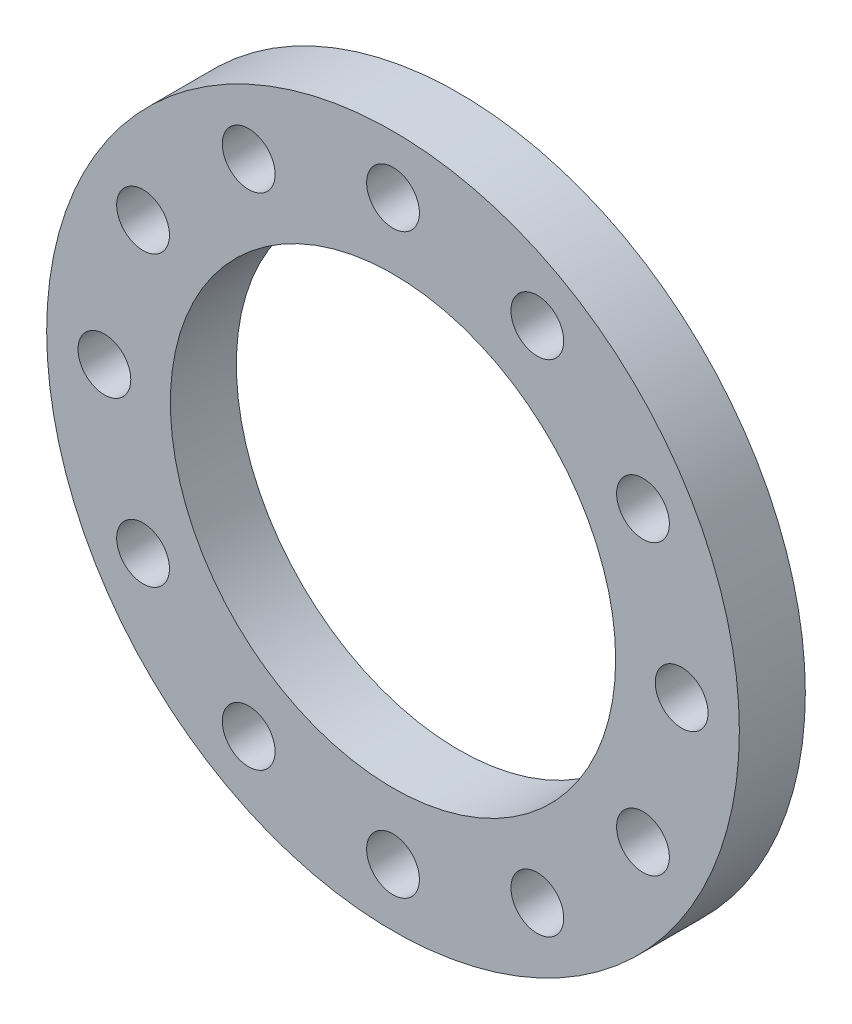
ISO-10303-21;
HEADER;
FILE_DESCRIPTION(('STEP AP214'),'2;1');
FILE_NAME('part.step','',(''),(''),'','','');
FILE_SCHEMA(('AUTOMOTIVE_DESIGN { 1 0 10303 214 1 1 1 1 }'));
ENDSEC;
DATA;
#1=APPLICATION_CONTEXT('core data for automotive mechanical design processes');
#2=APPLICATION_PROTOCOL_DEFINITION('international standard','automotive_design',2000,#1);
#3=PRODUCT_CONTEXT('',#1,'mechanical');
#4=PRODUCT('Part','Part','',(#3));
#5=PRODUCT_RELATED_PRODUCT_CATEGORY('part','',(#4));
#6=PRODUCT_DEFINITION_FORMATION('','',#4);
#7=PRODUCT_DEFINITION_CONTEXT('part definition',#1,'design');
#8=PRODUCT_DEFINITION('design','',#6,#7);
#9=PRODUCT_DEFINITION_SHAPE('','',#8);
#10=(LENGTH_UNIT() NAMED_UNIT(*) SI_UNIT(.MILLI.,.METRE.));
#11=(NAMED_UNIT(*) PLANE_ANGLE_UNIT() SI_UNIT($,.RADIAN.));
#12=(NAMED_UNIT(*) SI_UNIT($,.STERADIAN.) SOLID_ANGLE_UNIT());
#13=UNCERTAINTY_MEASURE_WITH_UNIT(LENGTH_MEASURE(1.E-05),#10,'distance_accuracy_value','');
#14=(GEOMETRIC_REPRESENTATION_CONTEXT(3) GLOBAL_UNCERTAINTY_ASSIGNED_CONTEXT((#13)) GLOBAL_UNIT_ASSIGNED_CONTEXT((#10,
#11,#12)) REPRESENTATION_CONTEXT('',''));
#15=CARTESIAN_POINT('',(0.,0.,0.));
#16=DIRECTION('',(0.,0.,1.));
#17=DIRECTION('',(1.,0.,0.));
#18=AXIS2_PLACEMENT_3D('',#15,#16,#17);
#19=CARTESIAN_POINT('',(0.,0.,4.));
#20=DIRECTION('',(0.,0.,1.));
#21=DIRECTION('',(1.,0.,0.));
#22=AXIS2_PLACEMENT_3D('',#19,#20,#21);
#23=PLANE('',#22);
#24=CARTESIAN_POINT('',(15.1554445662292,8.74999999999743,4.));
#25=DIRECTION('',(0.,0.,1.));
#26=DIRECTION('',(1.,0.,0.));
#27=AXIS2_PLACEMENT_3D('',#24,#25,#26);
#28=CIRCLE('',#27,1.6);
#29=CARTESIAN_POINT('',(16.7554445662292,8.74999999999743,4.));
#30=VERTEX_POINT('',#29);
#31=EDGE_CURVE('E111',#30,#30,#28,.T.);
#32=ORIENTED_EDGE('',*,*,#31,.F.);
#33=EDGE_LOOP('',(#32));
#34=FACE_BOUND('',#33,.T.);
#35=CARTESIAN_POINT('',(-15.1554445662262,-8.75000000000258,4.));
#36=DIRECTION('',(0.,0.,1.));
#37=DIRECTION('',(1.,0.,0.));
#38=AXIS2_PLACEMENT_3D('',#35,#36,#37);
#39=CIRCLE('',#38,1.6);
#40=CARTESIAN_POINT('',(-13.5554445662262,-8.75000000000258,4.));
#41=VERTEX_POINT('',#40);
#42=EDGE_CURVE('E99',#41,#41,#39,.T.);
#43=ORIENTED_EDGE('',*,*,#42,.F.);
#44=EDGE_LOOP('',(#43));
#45=FACE_BOUND('',#44,.T.);
#46=CARTESIAN_POINT('',(-15.1554445662247,8.75,4.));
#47=DIRECTION('',(0.,0.,1.));
#48=DIRECTION('',(1.,0.,0.));
#49=AXIS2_PLACEMENT_3D('',#46,#47,#48);
#50=CIRCLE('',#49,1.6);
#51=CARTESIAN_POINT('',(-13.5554445662247,8.75,4.));
#52=VERTEX_POINT('',#51);
#53=EDGE_CURVE('E87',#52,#52,#50,.T.);
#54=ORIENTED_EDGE('',*,*,#53,.F.);
#55=EDGE_LOOP('',(#54));
#56=FACE_BOUND('',#55,.T.);
#57=CARTESIAN_POINT('',(15.1554445662306,-8.75,4.));
#58=DIRECTION('',(0.,0.,1.));
#59=DIRECTION('',(1.,0.,0.));
#60=AXIS2_PLACEMENT_3D('',#57,#58,#59);
#61=CIRCLE('',#60,1.6);
#62=CARTESIAN_POINT('',(16.7554445662306,-8.75,4.));
#63=VERTEX_POINT('',#62);
#64=EDGE_CURVE('E75',#63,#63,#61,.T.);
#65=ORIENTED_EDGE('',*,*,#64,.F.);
#66=EDGE_LOOP('',(#65));
#67=FACE_BOUND('',#66,.T.);
#68=CARTESIAN_POINT('',(0.,-17.5,4.));
#69=DIRECTION('',(0.,0.,1.));
#70=DIRECTION('',(1.,0.,0.));
#71=AXIS2_PLACEMENT_3D('',#68,#69,#70);
#72=CIRCLE('',#71,1.6);
#73=CARTESIAN_POINT('',(1.6,-17.5,4.));
#74=VERTEX_POINT('',#73);
#75=EDGE_CURVE('E63',#74,#74,#72,.T.);
#76=ORIENTED_EDGE('',*,*,#75,.F.);
#77=EDGE_LOOP('',(#76));
#78=FACE_BOUND('',#77,.T.);
#79=CARTESIAN_POINT('',(0.,17.5,4.));
#80=DIRECTION('',(0.,0.,1.));
#81=DIRECTION('',(1.,0.,0.));
#82=AXIS2_PLACEMENT_3D('',#79,#80,#81);
#83=CIRCLE('',#82,1.6);
#84=CARTESIAN_POINT('',(1.6,17.5,4.));
#85=VERTEX_POINT('',#84);
#86=EDGE_CURVE('E51',#85,#85,#83,.T.);
#87=ORIENTED_EDGE('',*,*,#86,.F.);
#88=EDGE_LOOP('',(#87));
#89=FACE_BOUND('',#88,.T.);
#90=CARTESIAN_POINT('',(0.,0.,4.));
#91=DIRECTION('',(0.,0.,1.));
#92=DIRECTION('',(1.,0.,0.));
#93=AXIS2_PLACEMENT_3D('',#90,#91,#92);
#94=CIRCLE('',#93,21.);
#95=CARTESIAN_POINT('',(21.,0.,4.));
#96=VERTEX_POINT('',#95);
#97=EDGE_CURVE('E10',#96,#96,#94,.T.);
#98=ORIENTED_EDGE('',*,*,#97,.T.);
#99=EDGE_LOOP('',(#98));
#100=FACE_BOUND('',#99,.T.);
#101=CARTESIAN_POINT('',(0.,0.,4.));
#102=DIRECTION('',(0.,0.,1.));
#103=DIRECTION('',(1.,0.,0.));
#104=AXIS2_PLACEMENT_3D('',#101,#102,#103);
#105=CIRCLE('',#104,13.5);
#106=CARTESIAN_POINT('',(13.5,0.,4.));
#107=VERTEX_POINT('',#106);
#108=EDGE_CURVE('E46',#107,#107,#105,.T.);
#109=ORIENTED_EDGE('',*,*,#108,.F.);
#110=EDGE_LOOP('',(#109));
#111=FACE_BOUND('',#110,.T.);
#112=CARTESIAN_POINT('',(17.5,0.,4.));
#113=DIRECTION('',(0.,0.,1.));
#114=DIRECTION('',(1.,0.,0.));
#115=AXIS2_PLACEMENT_3D('',#112,#113,#114);
#116=CIRCLE('',#115,1.6);
#117=CARTESIAN_POINT('',(19.1,0.,4.));
#118=VERTEX_POINT('',#117);
#119=EDGE_CURVE('E57',#118,#118,#116,.T.);
#120=ORIENTED_EDGE('',*,*,#119,.F.);
#121=EDGE_LOOP('',(#120));
#122=FACE_BOUND('',#121,.T.);
#123=CARTESIAN_POINT('',(-17.5,0.,4.));
#124=DIRECTION('',(0.,0.,1.));
#125=DIRECTION('',(1.,0.,0.));
#126=AXIS2_PLACEMENT_3D('',#123,#124,#125);
#127=CIRCLE('',#126,1.6);
#128=CARTESIAN_POINT('',(-15.9,0.,4.));
#129=VERTEX_POINT('',#128);
#130=EDGE_CURVE('E69',#129,#129,#127,.T.);
#131=ORIENTED_EDGE('',*,*,#130,.F.);
#132=EDGE_LOOP('',(#131));
#133=FACE_BOUND('',#132,.T.);
#134=CARTESIAN_POINT('',(-8.74999999999703,-15.1554445662277,4.));
#135=DIRECTION('',(0.,0.,1.));
#136=DIRECTION('',(1.,0.,0.));
#137=AXIS2_PLACEMENT_3D('',#134,#135,#136);
#138=CIRCLE('',#137,1.6);
#139=CARTESIAN_POINT('',(-7.14999999999703,-15.1554445662277,4.));
#140=VERTEX_POINT('',#139);
#141=EDGE_CURVE('E81',#140,#140,#138,.T.);
#142=ORIENTED_EDGE('',*,*,#141,.F.);
#143=EDGE_LOOP('',(#142));
#144=FACE_BOUND('',#143,.T.);
#145=CARTESIAN_POINT('',(8.75000000000297,15.1554445662277,4.));
#146=DIRECTION('',(0.,0.,1.));
#147=DIRECTION('',(1.,0.,0.));
#148=AXIS2_PLACEMENT_3D('',#145,#146,#147);
#149=CIRCLE('',#148,1.6);
#150=CARTESIAN_POINT('',(10.350000000003,15.1554445662277,4.));
#151=VERTEX_POINT('',#150);
#152=EDGE_CURVE('E93',#151,#151,#149,.T.);
#153=ORIENTED_EDGE('',*,*,#152,.F.);
#154=EDGE_LOOP('',(#153));
#155=FACE_BOUND('',#154,.T.);
#156=CARTESIAN_POINT('',(-8.74999999999852,15.1554445662251,4.));
#157=DIRECTION('',(0.,0.,1.));
#158=DIRECTION('',(1.,0.,0.));
#159=AXIS2_PLACEMENT_3D('',#156,#157,#158);
#160=CIRCLE('',#159,1.6);
#161=CARTESIAN_POINT('',(-7.14999999999853,15.1554445662251,4.));
#162=VERTEX_POINT('',#161);
#163=EDGE_CURVE('E105',#162,#162,#160,.T.);
#164=ORIENTED_EDGE('',*,*,#163,.F.);
#165=EDGE_LOOP('',(#164));
#166=FACE_BOUND('',#165,.T.);
#167=CARTESIAN_POINT('',(8.75000000000149,-15.1554445662302,4.));
#168=DIRECTION('',(0.,0.,1.));
#169=DIRECTION('',(1.,0.,0.));
#170=AXIS2_PLACEMENT_3D('',#167,#168,#169);
#171=CIRCLE('',#170,1.6);
#172=CARTESIAN_POINT('',(10.3500000000015,-15.1554445662302,4.));
#173=VERTEX_POINT('',#172);
#174=EDGE_CURVE('E117',#173,#173,#171,.T.);
#175=ORIENTED_EDGE('',*,*,#174,.F.);
#176=EDGE_LOOP('',(#175));
#177=FACE_BOUND('',#176,.T.);
#178=ADVANCED_FACE('F35',(#34,#45,#56,#67,#78,#89,#100,#111,#122,#133,#144,#155,#166,#177),#23,.T.);
#179=CARTESIAN_POINT('',(0.,0.,0.));
#180=DIRECTION('',(0.,0.,1.));
#181=DIRECTION('',(1.,0.,0.));
#182=AXIS2_PLACEMENT_3D('',#179,#180,#181);
#183=PLANE('',#182);
#184=CARTESIAN_POINT('',(0.,0.,0.));
#185=DIRECTION('',(0.,0.,1.));
#186=DIRECTION('',(1.,0.,0.));
#187=AXIS2_PLACEMENT_3D('',#184,#185,#186);
#188=CIRCLE('',#187,21.);
#189=CARTESIAN_POINT('',(21.,0.,0.));
#190=VERTEX_POINT('',#189);
#191=EDGE_CURVE('E39',#190,#190,#188,.T.);
#192=ORIENTED_EDGE('',*,*,#191,.F.);
#193=EDGE_LOOP('',(#192));
#194=FACE_BOUND('',#193,.T.);
#195=CARTESIAN_POINT('',(0.,0.,0.));
#196=DIRECTION('',(0.,0.,1.));
#197=DIRECTION('',(1.,0.,0.));
#198=AXIS2_PLACEMENT_3D('',#195,#196,#197);
#199=CIRCLE('',#198,13.5);
#200=CARTESIAN_POINT('',(13.5,0.,0.));
#201=VERTEX_POINT('',#200);
#202=EDGE_CURVE('E48',#201,#201,#199,.T.);
#203=ORIENTED_EDGE('',*,*,#202,.T.);
#204=EDGE_LOOP('',(#203));
#205=FACE_BOUND('',#204,.T.);
#206=CARTESIAN_POINT('',(0.,17.5,0.));
#207=DIRECTION('',(0.,0.,1.));
#208=DIRECTION('',(1.,0.,0.));
#209=AXIS2_PLACEMENT_3D('',#206,#207,#208);
#210=CIRCLE('',#209,1.6);
#211=CARTESIAN_POINT('',(1.6,17.5,0.));
#212=VERTEX_POINT('',#211);
#213=EDGE_CURVE('E54',#212,#212,#210,.T.);
#214=ORIENTED_EDGE('',*,*,#213,.T.);
#215=EDGE_LOOP('',(#214));
#216=FACE_BOUND('',#215,.T.);
#217=CARTESIAN_POINT('',(17.5,0.,0.));
#218=DIRECTION('',(0.,0.,1.));
#219=DIRECTION('',(1.,0.,0.));
#220=AXIS2_PLACEMENT_3D('',#217,#218,#219);
#221=CIRCLE('',#220,1.6);
#222=CARTESIAN_POINT('',(19.1,0.,0.));
#223=VERTEX_POINT('',#222);
#224=EDGE_CURVE('E60',#223,#223,#221,.T.);
#225=ORIENTED_EDGE('',*,*,#224,.T.);
#226=EDGE_LOOP('',(#225));
#227=FACE_BOUND('',#226,.T.);
#228=CARTESIAN_POINT('',(0.,-17.5,0.));
#229=DIRECTION('',(0.,0.,1.));
#230=DIRECTION('',(1.,0.,0.));
#231=AXIS2_PLACEMENT_3D('',#228,#229,#230);
#232=CIRCLE('',#231,1.6);
#233=CARTESIAN_POINT('',(1.6,-17.5,0.));
#234=VERTEX_POINT('',#233);
#235=EDGE_CURVE('E66',#234,#234,#232,.T.);
#236=ORIENTED_EDGE('',*,*,#235,.T.);
#237=EDGE_LOOP('',(#236));
#238=FACE_BOUND('',#237,.T.);
#239=CARTESIAN_POINT('',(-17.5,0.,0.));
#240=DIRECTION('',(0.,0.,1.));
#241=DIRECTION('',(1.,0.,0.));
#242=AXIS2_PLACEMENT_3D('',#239,#240,#241);
#243=CIRCLE('',#242,1.6);
#244=CARTESIAN_POINT('',(-15.9,0.,0.));
#245=VERTEX_POINT('',#244);
#246=EDGE_CURVE('E72',#245,#245,#243,.T.);
#247=ORIENTED_EDGE('',*,*,#246,.T.);
#248=EDGE_LOOP('',(#247));
#249=FACE_BOUND('',#248,.T.);
#250=CARTESIAN_POINT('',(15.1554445662306,-8.75,0.));
#251=DIRECTION('',(0.,0.,1.));
#252=DIRECTION('',(1.,0.,0.));
#253=AXIS2_PLACEMENT_3D('',#250,#251,#252);
#254=CIRCLE('',#253,1.6);
#255=CARTESIAN_POINT('',(16.7554445662306,-8.75,0.));
#256=VERTEX_POINT('',#255);
#257=EDGE_CURVE('E78',#256,#256,#254,.T.);
#258=ORIENTED_EDGE('',*,*,#257,.T.);
#259=EDGE_LOOP('',(#258));
#260=FACE_BOUND('',#259,.T.);
#261=CARTESIAN_POINT('',(-8.74999999999703,-15.1554445662277,0.));
#262=DIRECTION('',(0.,0.,1.));
#263=DIRECTION('',(1.,0.,0.));
#264=AXIS2_PLACEMENT_3D('',#261,#262,#263);
#265=CIRCLE('',#264,1.6);
#266=CARTESIAN_POINT('',(-7.14999999999703,-15.1554445662277,0.));
#267=VERTEX_POINT('',#266);
#268=EDGE_CURVE('E84',#267,#267,#265,.T.);
#269=ORIENTED_EDGE('',*,*,#268,.T.);
#270=EDGE_LOOP('',(#269));
#271=FACE_BOUND('',#270,.T.);
#272=CARTESIAN_POINT('',(-15.1554445662247,8.75,0.));
#273=DIRECTION('',(0.,0.,1.));
#274=DIRECTION('',(1.,0.,0.));
#275=AXIS2_PLACEMENT_3D('',#272,#273,#274);
#276=CIRCLE('',#275,1.6);
#277=CARTESIAN_POINT('',(-13.5554445662247,8.75,0.));
#278=VERTEX_POINT('',#277);
#279=EDGE_CURVE('E90',#278,#278,#276,.T.);
#280=ORIENTED_EDGE('',*,*,#279,.T.);
#281=EDGE_LOOP('',(#280));
#282=FACE_BOUND('',#281,.T.);
#283=CARTESIAN_POINT('',(8.75000000000297,15.1554445662277,0.));
#284=DIRECTION('',(0.,0.,1.));
#285=DIRECTION('',(1.,0.,0.));
#286=AXIS2_PLACEMENT_3D('',#283,#284,#285);
#287=CIRCLE('',#286,1.6);
#288=CARTESIAN_POINT('',(10.350000000003,15.1554445662277,0.));
#289=VERTEX_POINT('',#288);
#290=EDGE_CURVE('E96',#289,#289,#287,.T.);
#291=ORIENTED_EDGE('',*,*,#290,.T.);
#292=EDGE_LOOP('',(#291));
#293=FACE_BOUND('',#292,.T.);
#294=CARTESIAN_POINT('',(-15.1554445662262,-8.75000000000258,0.));
#295=DIRECTION('',(0.,0.,1.));
#296=DIRECTION('',(1.,0.,0.));
#297=AXIS2_PLACEMENT_3D('',#294,#295,#296);
#298=CIRCLE('',#297,1.6);
#299=CARTESIAN_POINT('',(-13.5554445662262,-8.75000000000258,0.));
#300=VERTEX_POINT('',#299);
#301=EDGE_CURVE('E102',#300,#300,#298,.T.);
#302=ORIENTED_EDGE('',*,*,#301,.T.);
#303=EDGE_LOOP('',(#302));
#304=FACE_BOUND('',#303,.T.);
#305=CARTESIAN_POINT('',(-8.74999999999852,15.1554445662251,0.));
#306=DIRECTION('',(0.,0.,1.));
#307=DIRECTION('',(1.,0.,0.));
#308=AXIS2_PLACEMENT_3D('',#305,#306,#307);
#309=CIRCLE('',#308,1.6);
#310=CARTESIAN_POINT('',(-7.14999999999853,15.1554445662251,0.));
#311=VERTEX_POINT('',#310);
#312=EDGE_CURVE('E108',#311,#311,#309,.T.);
#313=ORIENTED_EDGE('',*,*,#312,.T.);
#314=EDGE_LOOP('',(#313));
#315=FACE_BOUND('',#314,.T.);
#316=CARTESIAN_POINT('',(15.1554445662292,8.74999999999743,0.));
#317=DIRECTION('',(0.,0.,1.));
#318=DIRECTION('',(1.,0.,0.));
#319=AXIS2_PLACEMENT_3D('',#316,#317,#318);
#320=CIRCLE('',#319,1.6);
#321=CARTESIAN_POINT('',(16.7554445662292,8.74999999999743,0.));
#322=VERTEX_POINT('',#321);
#323=EDGE_CURVE('E114',#322,#322,#320,.T.);
#324=ORIENTED_EDGE('',*,*,#323,.T.);
#325=EDGE_LOOP('',(#324));
#326=FACE_BOUND('',#325,.T.);
#327=CARTESIAN_POINT('',(8.75000000000149,-15.1554445662302,0.));
#328=DIRECTION('',(0.,0.,1.));
#329=DIRECTION('',(1.,0.,0.));
#330=AXIS2_PLACEMENT_3D('',#327,#328,#329);
#331=CIRCLE('',#330,1.6);
#332=CARTESIAN_POINT('',(10.3500000000015,-15.1554445662302,0.));
#333=VERTEX_POINT('',#332);
#334=EDGE_CURVE('E120',#333,#333,#331,.T.);
#335=ORIENTED_EDGE('',*,*,#334,.T.);
#336=EDGE_LOOP('',(#335));
#337=FACE_BOUND('',#336,.T.);
#338=ADVANCED_FACE('F130',(#194,#205,#216,#227,#238,#249,#260,#271,#282,#293,#304,#315,#326,
#337),#183,.F.);
#339=CARTESIAN_POINT('',(0.,0.,4.));
#340=DIRECTION('',(0.,0.,-1.));
#341=DIRECTION('',(-1.,0.,0.));
#342=AXIS2_PLACEMENT_3D('',#339,#340,#341);
#343=CYLINDRICAL_SURFACE('',#342,21.);
#344=ORIENTED_EDGE('',*,*,#97,.F.);
#345=EDGE_LOOP('',(#344));
#346=FACE_BOUND('',#345,.T.);
#347=ORIENTED_EDGE('',*,*,#191,.T.);
#348=EDGE_LOOP('',(#347));
#349=FACE_BOUND('',#348,.T.);
#350=ADVANCED_FACE('F37',(#346,#349),#343,.T.);
#351=CARTESIAN_POINT('',(0.,0.,4.));
#352=DIRECTION('',(0.,0.,-1.));
#353=DIRECTION('',(-1.,0.,0.));
#354=AXIS2_PLACEMENT_3D('',#351,#352,#353);
#355=CYLINDRICAL_SURFACE('',#354,13.5);
#356=ORIENTED_EDGE('',*,*,#108,.T.);
#357=EDGE_LOOP('',(#356));
#358=FACE_BOUND('',#357,.T.);
#359=ORIENTED_EDGE('',*,*,#202,.F.);
#360=EDGE_LOOP('',(#359));
#361=FACE_BOUND('',#360,.T.);
#362=ADVANCED_FACE('F140',(#358,#361),#355,.F.);
#363=CARTESIAN_POINT('',(0.,17.5,4.));
#364=DIRECTION('',(0.,0.,-1.));
#365=DIRECTION('',(-1.,0.,0.));
#366=AXIS2_PLACEMENT_3D('',#363,#364,#365);
#367=CYLINDRICAL_SURFACE('',#366,1.6);
#368=ORIENTED_EDGE('',*,*,#86,.T.);
#369=EDGE_LOOP('',(#368));
#370=FACE_BOUND('',#369,.T.);
#371=ORIENTED_EDGE('',*,*,#213,.F.);
#372=EDGE_LOOP('',(#371));
#373=FACE_BOUND('',#372,.T.);
#374=ADVANCED_FACE('F143',(#370,#373),#367,.F.);
#375=CARTESIAN_POINT('',(17.5,0.,4.));
#376=DIRECTION('',(0.,0.,-1.));
#377=DIRECTION('',(-1.,0.,0.));
#378=AXIS2_PLACEMENT_3D('',#375,#376,#377);
#379=CYLINDRICAL_SURFACE('',#378,1.6);
#380=ORIENTED_EDGE('',*,*,#119,.T.);
#381=EDGE_LOOP('',(#380));
#382=FACE_BOUND('',#381,.T.);
#383=ORIENTED_EDGE('',*,*,#224,.F.);
#384=EDGE_LOOP('',(#383));
#385=FACE_BOUND('',#384,.T.);
#386=ADVANCED_FACE('F147',(#382,#385),#379,.F.);
#387=CARTESIAN_POINT('',(0.,-17.5,4.));
#388=DIRECTION('',(0.,0.,-1.));
#389=DIRECTION('',(-1.,0.,0.));
#390=AXIS2_PLACEMENT_3D('',#387,#388,#389);
#391=CYLINDRICAL_SURFACE('',#390,1.6);
#392=ORIENTED_EDGE('',*,*,#75,.T.);
#393=EDGE_LOOP('',(#392));
#394=FACE_BOUND('',#393,.T.);
#395=ORIENTED_EDGE('',*,*,#235,.F.);
#396=EDGE_LOOP('',(#395));
#397=FACE_BOUND('',#396,.T.);
#398=ADVANCED_FACE('F151',(#394,#397),#391,.F.);
#399=CARTESIAN_POINT('',(-17.5,0.,4.));
#400=DIRECTION('',(0.,0.,-1.));
#401=DIRECTION('',(-1.,0.,0.));
#402=AXIS2_PLACEMENT_3D('',#399,#400,#401);
#403=CYLINDRICAL_SURFACE('',#402,1.6);
#404=ORIENTED_EDGE('',*,*,#130,.T.);
#405=EDGE_LOOP('',(#404));
#406=FACE_BOUND('',#405,.T.);
#407=ORIENTED_EDGE('',*,*,#246,.F.);
#408=EDGE_LOOP('',(#407));
#409=FACE_BOUND('',#408,.T.);
#410=ADVANCED_FACE('F155',(#406,#409),#403,.F.);
#411=CARTESIAN_POINT('',(15.1554445662306,-8.75,4.));
#412=DIRECTION('',(0.,0.,-1.));
#413=DIRECTION('',(-1.,0.,0.));
#414=AXIS2_PLACEMENT_3D('',#411,#412,#413);
#415=CYLINDRICAL_SURFACE('',#414,1.6);
#416=ORIENTED_EDGE('',*,*,#64,.T.);
#417=EDGE_LOOP('',(#416));
#418=FACE_BOUND('',#417,.T.);
#419=ORIENTED_EDGE('',*,*,#257,.F.);
#420=EDGE_LOOP('',(#419));
#421=FACE_BOUND('',#420,.T.);
#422=ADVANCED_FACE('F159',(#418,#421),#415,.F.);
#423=CARTESIAN_POINT('',(-8.74999999999703,-15.1554445662277,4.));
#424=DIRECTION('',(0.,0.,-1.));
#425=DIRECTION('',(-1.,0.,0.));
#426=AXIS2_PLACEMENT_3D('',#423,#424,#425);
#427=CYLINDRICAL_SURFACE('',#426,1.6);
#428=ORIENTED_EDGE('',*,*,#141,.T.);
#429=EDGE_LOOP('',(#428));
#430=FACE_BOUND('',#429,.T.);
#431=ORIENTED_EDGE('',*,*,#268,.F.);
#432=EDGE_LOOP('',(#431));
#433=FACE_BOUND('',#432,.T.);
#434=ADVANCED_FACE('F163',(#430,#433),#427,.F.);
#435=CARTESIAN_POINT('',(-15.1554445662247,8.75,4.));
#436=DIRECTION('',(0.,0.,-1.));
#437=DIRECTION('',(-1.,0.,0.));
#438=AXIS2_PLACEMENT_3D('',#435,#436,#437);
#439=CYLINDRICAL_SURFACE('',#438,1.6);
#440=ORIENTED_EDGE('',*,*,#53,.T.);
#441=EDGE_LOOP('',(#440));
#442=FACE_BOUND('',#441,.T.);
#443=ORIENTED_EDGE('',*,*,#279,.F.);
#444=EDGE_LOOP('',(#443));
#445=FACE_BOUND('',#444,.T.);
#446=ADVANCED_FACE('F167',(#442,#445),#439,.F.);
#447=CARTESIAN_POINT('',(8.75000000000297,15.1554445662277,4.));
#448=DIRECTION('',(0.,0.,-1.));
#449=DIRECTION('',(-1.,0.,0.));
#450=AXIS2_PLACEMENT_3D('',#447,#448,#449);
#451=CYLINDRICAL_SURFACE('',#450,1.6);
#452=ORIENTED_EDGE('',*,*,#152,.T.);
#453=EDGE_LOOP('',(#452));
#454=FACE_BOUND('',#453,.T.);
#455=ORIENTED_EDGE('',*,*,#290,.F.);
#456=EDGE_LOOP('',(#455));
#457=FACE_BOUND('',#456,.T.);
#458=ADVANCED_FACE('F171',(#454,#457),#451,.F.);
#459=CARTESIAN_POINT('',(-15.1554445662262,-8.75000000000258,4.));
#460=DIRECTION('',(0.,0.,-1.));
#461=DIRECTION('',(-1.,0.,0.));
#462=AXIS2_PLACEMENT_3D('',#459,#460,#461);
#463=CYLINDRICAL_SURFACE('',#462,1.6);
#464=ORIENTED_EDGE('',*,*,#42,.T.);
#465=EDGE_LOOP('',(#464));
#466=FACE_BOUND('',#465,.T.);
#467=ORIENTED_EDGE('',*,*,#301,.F.);
#468=EDGE_LOOP('',(#467));
#469=FACE_BOUND('',#468,.T.);
#470=ADVANCED_FACE('F175',(#466,#469),#463,.F.);
#471=CARTESIAN_POINT('',(-8.74999999999852,15.1554445662251,4.));
#472=DIRECTION('',(0.,0.,-1.));
#473=DIRECTION('',(-1.,0.,0.));
#474=AXIS2_PLACEMENT_3D('',#471,#472,#473);
#475=CYLINDRICAL_SURFACE('',#474,1.6);
#476=ORIENTED_EDGE('',*,*,#163,.T.);
#477=EDGE_LOOP('',(#476));
#478=FACE_BOUND('',#477,.T.);
#479=ORIENTED_EDGE('',*,*,#312,.F.);
#480=EDGE_LOOP('',(#479));
#481=FACE_BOUND('',#480,.T.);
#482=ADVANCED_FACE('F179',(#478,#481),#475,.F.);
#483=CARTESIAN_POINT('',(15.1554445662292,8.74999999999743,4.));
#484=DIRECTION('',(0.,0.,-1.));
#485=DIRECTION('',(-1.,0.,0.));
#486=AXIS2_PLACEMENT_3D('',#483,#484,#485);
#487=CYLINDRICAL_SURFACE('',#486,1.6);
#488=ORIENTED_EDGE('',*,*,#31,.T.);
#489=EDGE_LOOP('',(#488));
#490=FACE_BOUND('',#489,.T.);
#491=ORIENTED_EDGE('',*,*,#323,.F.);
#492=EDGE_LOOP('',(#491));
#493=FACE_BOUND('',#492,.T.);
#494=ADVANCED_FACE('F183',(#490,#493),#487,.F.);
#495=CARTESIAN_POINT('',(8.75000000000149,-15.1554445662302,4.));
#496=DIRECTION('',(0.,0.,-1.));
#497=DIRECTION('',(-1.,0.,0.));
#498=AXIS2_PLACEMENT_3D('',#495,#496,#497);
#499=CYLINDRICAL_SURFACE('',#498,1.6);
#500=ORIENTED_EDGE('',*,*,#174,.T.);
#501=EDGE_LOOP('',(#500));
#502=FACE_BOUND('',#501,.T.);
#503=ORIENTED_EDGE('',*,*,#334,.F.);
#504=EDGE_LOOP('',(#503));
#505=FACE_BOUND('',#504,.T.);
#506=ADVANCED_FACE('F126',(#502,#505),#499,.F.);
#507=CLOSED_SHELL('',(#178,#338,#350,#362,#374,#386,#398,#410,#422,#434,#446,#458,#470,#482,
#494,#506));
#508=MANIFOLD_SOLID_BREP('B2',#507);
#509=ADVANCED_BREP_SHAPE_REPRESENTATION('',(#18,#508),#14);
#510=SHAPE_DEFINITION_REPRESENTATION(#9,#509);
ENDSEC;
END-ISO-10303-21;
